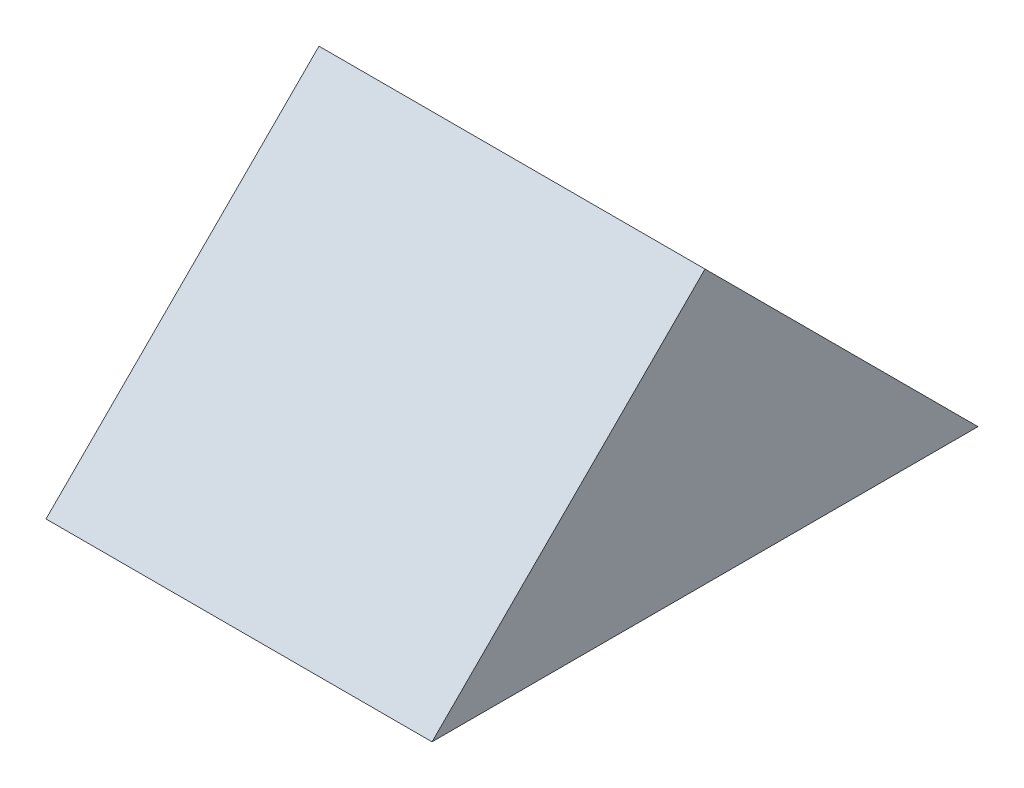
ISO-10303-21;
HEADER;
FILE_DESCRIPTION(('STEP AP214'),'2;1');
FILE_NAME('part.step','',(''),(''),'','','');
FILE_SCHEMA(('AUTOMOTIVE_DESIGN { 1 0 10303 214 1 1 1 1 }'));
ENDSEC;
DATA;
#1=APPLICATION_CONTEXT('core data for automotive mechanical design processes');
#2=APPLICATION_PROTOCOL_DEFINITION('international standard','automotive_design',2000,#1);
#3=PRODUCT_CONTEXT('',#1,'mechanical');
#4=PRODUCT('Part','Part','',(#3));
#5=PRODUCT_RELATED_PRODUCT_CATEGORY('part','',(#4));
#6=PRODUCT_DEFINITION_FORMATION('','',#4);
#7=PRODUCT_DEFINITION_CONTEXT('part definition',#1,'design');
#8=PRODUCT_DEFINITION('design','',#6,#7);
#9=PRODUCT_DEFINITION_SHAPE('','',#8);
#10=(LENGTH_UNIT() NAMED_UNIT(*) SI_UNIT(.MILLI.,.METRE.));
#11=(NAMED_UNIT(*) PLANE_ANGLE_UNIT() SI_UNIT($,.RADIAN.));
#12=(NAMED_UNIT(*) SI_UNIT($,.STERADIAN.) SOLID_ANGLE_UNIT());
#13=UNCERTAINTY_MEASURE_WITH_UNIT(LENGTH_MEASURE(1.E-05),#10,'distance_accuracy_value','');
#14=(GEOMETRIC_REPRESENTATION_CONTEXT(3) GLOBAL_UNCERTAINTY_ASSIGNED_CONTEXT((#13)) GLOBAL_UNIT_ASSIGNED_CONTEXT((#10,
#11,#12)) REPRESENTATION_CONTEXT('',''));
#15=CARTESIAN_POINT('',(0.,0.,0.));
#16=DIRECTION('',(0.,0.,1.));
#17=DIRECTION('',(1.,0.,0.));
#18=AXIS2_PLACEMENT_3D('',#15,#16,#17);
#19=CARTESIAN_POINT('',(-15.,0.,-21.2132034355964));
#20=DIRECTION('',(0.,0.707106781186547,-0.707106781186548));
#21=DIRECTION('',(0.,0.707106781186548,0.707106781186547));
#22=AXIS2_PLACEMENT_3D('',#19,#20,#21);
#23=PLANE('',#22);
#24=DIRECTION('',(1.,0.,0.));
#25=VECTOR('',#24,1.);
#26=CARTESIAN_POINT('',(-15.,21.2132034355964,0.));
#27=LINE('',#26,#25);
#28=CARTESIAN_POINT('',(-15.,21.2132034355964,0.));
#29=VERTEX_POINT('',#28);
#30=CARTESIAN_POINT('',(15.,21.2132034355964,0.));
#31=VERTEX_POINT('',#30);
#32=EDGE_CURVE('E39',#29,#31,#27,.T.);
#33=ORIENTED_EDGE('',*,*,#32,.T.);
#34=DIRECTION('',(0.,0.707106781186548,0.707106781186547));
#35=VECTOR('',#34,1.);
#36=CARTESIAN_POINT('',(15.,0.,-21.2132034355964));
#37=LINE('',#36,#35);
#38=CARTESIAN_POINT('',(15.,0.,-21.2132034355964));
#39=VERTEX_POINT('',#38);
#40=EDGE_CURVE('E70',#39,#31,#37,.T.);
#41=ORIENTED_EDGE('',*,*,#40,.F.);
#42=DIRECTION('',(1.,0.,0.));
#43=VECTOR('',#42,1.);
#44=CARTESIAN_POINT('',(-15.,0.,-21.2132034355964));
#45=LINE('',#44,#43);
#46=CARTESIAN_POINT('',(-15.,0.,-21.2132034355964));
#47=VERTEX_POINT('',#46);
#48=EDGE_CURVE('E11',#47,#39,#45,.T.);
#49=ORIENTED_EDGE('',*,*,#48,.F.);
#50=DIRECTION('',(0.,0.707106781186548,0.707106781186547));
#51=VECTOR('',#50,1.);
#52=CARTESIAN_POINT('',(-15.,0.,-21.2132034355964));
#53=LINE('',#52,#51);
#54=EDGE_CURVE('E71',#47,#29,#53,.T.);
#55=ORIENTED_EDGE('',*,*,#54,.T.);
#56=EDGE_LOOP('',(#33,#41,#49,#55));
#57=FACE_BOUND('',#56,.T.);
#58=ADVANCED_FACE('F36',(#57),#23,.T.);
#59=CARTESIAN_POINT('',(-15.,0.,21.2132034355964));
#60=DIRECTION('',(0.,-1.,0.));
#61=DIRECTION('',(0.,0.,-1.));
#62=AXIS2_PLACEMENT_3D('',#59,#60,#61);
#63=PLANE('',#62);
#64=ORIENTED_EDGE('',*,*,#48,.T.);
#65=DIRECTION('',(0.,0.,-1.));
#66=VECTOR('',#65,1.);
#67=CARTESIAN_POINT('',(15.,0.,21.2132034355964));
#68=LINE('',#67,#66);
#69=CARTESIAN_POINT('',(15.,0.,21.2132034355964));
#70=VERTEX_POINT('',#69);
#71=EDGE_CURVE('E80',#70,#39,#68,.T.);
#72=ORIENTED_EDGE('',*,*,#71,.F.);
#73=DIRECTION('',(1.,0.,0.));
#74=VECTOR('',#73,1.);
#75=CARTESIAN_POINT('',(-15.,0.,21.2132034355964));
#76=LINE('',#75,#74);
#77=CARTESIAN_POINT('',(-15.,0.,21.2132034355964));
#78=VERTEX_POINT('',#77);
#79=EDGE_CURVE('E44',#78,#70,#76,.T.);
#80=ORIENTED_EDGE('',*,*,#79,.F.);
#81=DIRECTION('',(0.,0.,-1.));
#82=VECTOR('',#81,1.);
#83=CARTESIAN_POINT('',(-15.,0.,21.2132034355964));
#84=LINE('',#83,#82);
#85=EDGE_CURVE('E74',#78,#47,#84,.T.);
#86=ORIENTED_EDGE('',*,*,#85,.T.);
#87=EDGE_LOOP('',(#64,#72,#80,#86));
#88=FACE_BOUND('',#87,.T.);
#89=ADVANCED_FACE('F90',(#88),#63,.T.);
#90=CARTESIAN_POINT('',(-15.,21.2132034355964,0.));
#91=DIRECTION('',(0.,0.707106781186547,0.707106781186548));
#92=DIRECTION('',(0.,-0.707106781186548,0.707106781186547));
#93=AXIS2_PLACEMENT_3D('',#90,#91,#92);
#94=PLANE('',#93);
#95=ORIENTED_EDGE('',*,*,#79,.T.);
#96=DIRECTION('',(0.,-0.707106781186548,0.707106781186547));
#97=VECTOR('',#96,1.);
#98=CARTESIAN_POINT('',(15.,21.2132034355964,0.));
#99=LINE('',#98,#97);
#100=EDGE_CURVE('E76',#31,#70,#99,.T.);
#101=ORIENTED_EDGE('',*,*,#100,.F.);
#102=ORIENTED_EDGE('',*,*,#32,.F.);
#103=DIRECTION('',(0.,-0.707106781186548,0.707106781186547));
#104=VECTOR('',#103,1.);
#105=CARTESIAN_POINT('',(-15.,21.2132034355964,0.));
#106=LINE('',#105,#104);
#107=EDGE_CURVE('E87',#29,#78,#106,.T.);
#108=ORIENTED_EDGE('',*,*,#107,.T.);
#109=EDGE_LOOP('',(#95,#101,#102,#108));
#110=FACE_BOUND('',#109,.T.);
#111=ADVANCED_FACE('F77',(#110),#94,.T.);
#112=CARTESIAN_POINT('',(-15.,0.,0.));
#113=DIRECTION('',(1.,0.,0.));
#114=DIRECTION('',(0.,0.,-1.));
#115=AXIS2_PLACEMENT_3D('',#112,#113,#114);
#116=PLANE('',#115);
#117=ORIENTED_EDGE('',*,*,#54,.F.);
#118=ORIENTED_EDGE('',*,*,#85,.F.);
#119=ORIENTED_EDGE('',*,*,#107,.F.);
#120=EDGE_LOOP('',(#117,#118,#119));
#121=FACE_BOUND('',#120,.T.);
#122=ADVANCED_FACE('F92',(#121),#116,.F.);
#123=CARTESIAN_POINT('',(15.,0.,0.));
#124=DIRECTION('',(1.,0.,0.));
#125=DIRECTION('',(0.,0.,-1.));
#126=AXIS2_PLACEMENT_3D('',#123,#124,#125);
#127=PLANE('',#126);
#128=ORIENTED_EDGE('',*,*,#40,.T.);
#129=ORIENTED_EDGE('',*,*,#100,.T.);
#130=ORIENTED_EDGE('',*,*,#71,.T.);
#131=EDGE_LOOP('',(#128,#129,#130));
#132=FACE_BOUND('',#131,.T.);
#133=ADVANCED_FACE('F82',(#132),#127,.T.);
#134=CLOSED_SHELL('',(#58,#89,#111,#122,#133));
#135=MANIFOLD_SOLID_BREP('B2',#134);
#136=ADVANCED_BREP_SHAPE_REPRESENTATION('',(#18,#135),#14);
#137=SHAPE_DEFINITION_REPRESENTATION(#9,#136);
ENDSEC;
END-ISO-10303-21;
